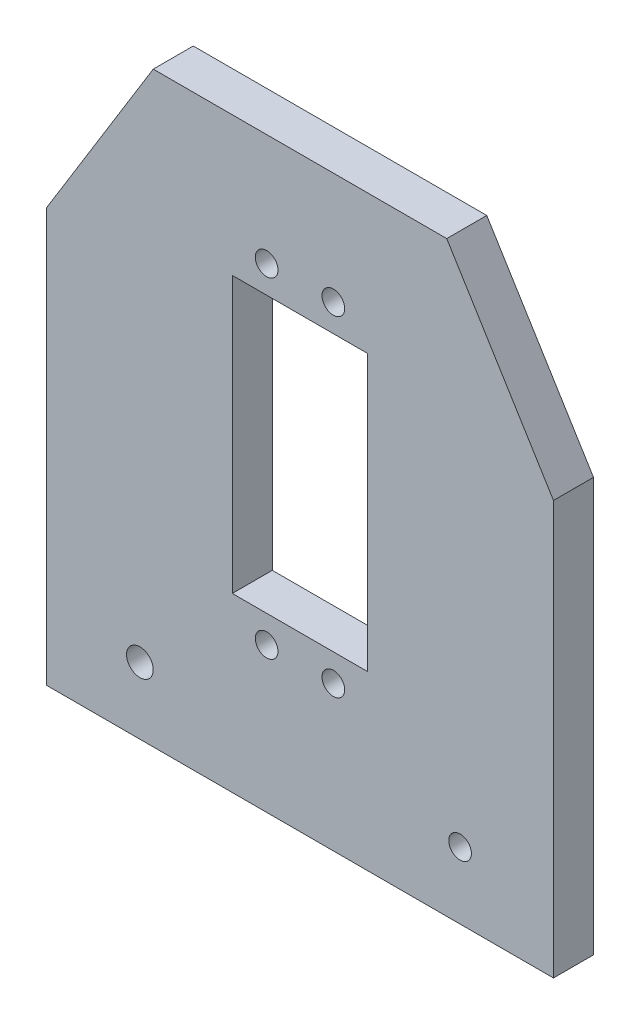
ISO-10303-21;
HEADER;
FILE_DESCRIPTION(('STEP AP214'),'2;1');
FILE_NAME('part.step','',(''),(''),'','','');
FILE_SCHEMA(('AUTOMOTIVE_DESIGN { 1 0 10303 214 1 1 1 1 }'));
ENDSEC;
DATA;
#1=APPLICATION_CONTEXT('core data for automotive mechanical design processes');
#2=APPLICATION_PROTOCOL_DEFINITION('international standard','automotive_design',2000,#1);
#3=PRODUCT_CONTEXT('',#1,'mechanical');
#4=PRODUCT('Part','Part','',(#3));
#5=PRODUCT_RELATED_PRODUCT_CATEGORY('part','',(#4));
#6=PRODUCT_DEFINITION_FORMATION('','',#4);
#7=PRODUCT_DEFINITION_CONTEXT('part definition',#1,'design');
#8=PRODUCT_DEFINITION('design','',#6,#7);
#9=PRODUCT_DEFINITION_SHAPE('','',#8);
#10=(LENGTH_UNIT() NAMED_UNIT(*) SI_UNIT(.MILLI.,.METRE.));
#11=(NAMED_UNIT(*) PLANE_ANGLE_UNIT() SI_UNIT($,.RADIAN.));
#12=(NAMED_UNIT(*) SI_UNIT($,.STERADIAN.) SOLID_ANGLE_UNIT());
#13=UNCERTAINTY_MEASURE_WITH_UNIT(LENGTH_MEASURE(1.E-05),#10,'distance_accuracy_value','');
#14=(GEOMETRIC_REPRESENTATION_CONTEXT(3) GLOBAL_UNCERTAINTY_ASSIGNED_CONTEXT((#13)) GLOBAL_UNIT_ASSIGNED_CONTEXT((#10,
#11,#12)) REPRESENTATION_CONTEXT('',''));
#15=CARTESIAN_POINT('',(0.,0.,0.));
#16=DIRECTION('',(0.,0.,1.));
#17=DIRECTION('',(1.,0.,0.));
#18=AXIS2_PLACEMENT_3D('',#15,#16,#17);
#19=CARTESIAN_POINT('',(0.,0.,6.));
#20=DIRECTION('',(0.,0.,1.));
#21=DIRECTION('',(1.,0.,0.));
#22=AXIS2_PLACEMENT_3D('',#19,#20,#21);
#23=PLANE('',#22);
#24=CARTESIAN_POINT('',(-24.,10.,6.));
#25=DIRECTION('',(0.,0.,1.));
#26=DIRECTION('',(1.,0.,0.));
#27=AXIS2_PLACEMENT_3D('',#24,#25,#26);
#28=CIRCLE('',#27,2.);
#29=CARTESIAN_POINT('',(-22.,10.,6.));
#30=VERTEX_POINT('',#29);
#31=EDGE_CURVE('E289',#30,#30,#28,.T.);
#32=ORIENTED_EDGE('',*,*,#31,.F.);
#33=EDGE_LOOP('',(#32));
#34=FACE_BOUND('',#33,.T.);
#35=CARTESIAN_POINT('',(5.,21.75,6.));
#36=DIRECTION('',(0.,0.,1.));
#37=DIRECTION('',(1.,0.,0.));
#38=AXIS2_PLACEMENT_3D('',#35,#36,#37);
#39=CIRCLE('',#38,1.7);
#40=CARTESIAN_POINT('',(6.7,21.75,6.));
#41=VERTEX_POINT('',#40);
#42=EDGE_CURVE('E301',#41,#41,#39,.T.);
#43=ORIENTED_EDGE('',*,*,#42,.F.);
#44=EDGE_LOOP('',(#43));
#45=FACE_BOUND('',#44,.T.);
#46=CARTESIAN_POINT('',(-5.,21.75,6.));
#47=DIRECTION('',(0.,0.,1.));
#48=DIRECTION('',(1.,0.,0.));
#49=AXIS2_PLACEMENT_3D('',#46,#47,#48);
#50=CIRCLE('',#49,1.7);
#51=CARTESIAN_POINT('',(-3.3,21.75,6.));
#52=VERTEX_POINT('',#51);
#53=EDGE_CURVE('E147',#52,#52,#50,.T.);
#54=ORIENTED_EDGE('',*,*,#53,.F.);
#55=EDGE_LOOP('',(#54));
#56=FACE_BOUND('',#55,.T.);
#57=DIRECTION('',(0.,-1.,0.));
#58=VECTOR('',#57,1.);
#59=CARTESIAN_POINT('',(-38.,62.,6.));
#60=LINE('',#59,#58);
#61=CARTESIAN_POINT('',(-38.,62.,6.));
#62=VERTEX_POINT('',#61);
#63=CARTESIAN_POINT('',(-38.,0.,6.));
#64=VERTEX_POINT('',#63);
#65=EDGE_CURVE('E157',#62,#64,#60,.T.);
#66=ORIENTED_EDGE('',*,*,#65,.T.);
#67=DIRECTION('',(1.,0.,0.));
#68=VECTOR('',#67,1.);
#69=CARTESIAN_POINT('',(-38.,0.,6.));
#70=LINE('',#69,#68);
#71=CARTESIAN_POINT('',(38.,0.,6.));
#72=VERTEX_POINT('',#71);
#73=EDGE_CURVE('E160',#64,#72,#70,.T.);
#74=ORIENTED_EDGE('',*,*,#73,.T.);
#75=DIRECTION('',(0.,1.,0.));
#76=VECTOR('',#75,1.);
#77=CARTESIAN_POINT('',(38.,0.,6.));
#78=LINE('',#77,#76);
#79=CARTESIAN_POINT('',(38.,62.,6.));
#80=VERTEX_POINT('',#79);
#81=EDGE_CURVE('E163',#72,#80,#78,.T.);
#82=ORIENTED_EDGE('',*,*,#81,.T.);
#83=DIRECTION('',(-0.524097425664335,0.851658316704544,0.));
#84=VECTOR('',#83,1.);
#85=CARTESIAN_POINT('',(38.,62.,6.));
#86=LINE('',#85,#84);
#87=CARTESIAN_POINT('',(22.,88.,6.));
#88=VERTEX_POINT('',#87);
#89=EDGE_CURVE('E165',#80,#88,#86,.T.);
#90=ORIENTED_EDGE('',*,*,#89,.T.);
#91=DIRECTION('',(-1.,0.,0.));
#92=VECTOR('',#91,1.);
#93=CARTESIAN_POINT('',(22.,88.,6.));
#94=LINE('',#93,#92);
#95=CARTESIAN_POINT('',(-22.,88.,6.));
#96=VERTEX_POINT('',#95);
#97=EDGE_CURVE('E167',#88,#96,#94,.T.);
#98=ORIENTED_EDGE('',*,*,#97,.T.);
#99=DIRECTION('',(-0.524097425664335,-0.851658316704544,0.));
#100=VECTOR('',#99,1.);
#101=CARTESIAN_POINT('',(-22.,88.,6.));
#102=LINE('',#101,#100);
#103=EDGE_CURVE('E169',#96,#62,#102,.T.);
#104=ORIENTED_EDGE('',*,*,#103,.T.);
#105=EDGE_LOOP('',(#66,#74,#82,#90,#98,#104));
#106=FACE_BOUND('',#105,.T.);
#107=DIRECTION('',(1.,0.,0.));
#108=VECTOR('',#107,1.);
#109=CARTESIAN_POINT('',(-10.15,25.85,6.));
#110=LINE('',#109,#108);
#111=CARTESIAN_POINT('',(-10.15,25.85,6.));
#112=VERTEX_POINT('',#111);
#113=CARTESIAN_POINT('',(10.15,25.85,6.));
#114=VERTEX_POINT('',#113);
#115=EDGE_CURVE('E126',#112,#114,#110,.T.);
#116=ORIENTED_EDGE('',*,*,#115,.F.);
#117=DIRECTION('',(0.,-1.,0.));
#118=VECTOR('',#117,1.);
#119=CARTESIAN_POINT('',(-10.15,25.85,6.));
#120=LINE('',#119,#118);
#121=CARTESIAN_POINT('',(-10.15,67.15,6.));
#122=VERTEX_POINT('',#121);
#123=EDGE_CURVE('E118',#122,#112,#120,.T.);
#124=ORIENTED_EDGE('',*,*,#123,.F.);
#125=DIRECTION('',(-1.,0.,0.));
#126=VECTOR('',#125,1.);
#127=CARTESIAN_POINT('',(-10.15,67.15,6.));
#128=LINE('',#127,#126);
#129=CARTESIAN_POINT('',(10.15,67.15,6.));
#130=VERTEX_POINT('',#129);
#131=EDGE_CURVE('E141',#130,#122,#128,.T.);
#132=ORIENTED_EDGE('',*,*,#131,.F.);
#133=DIRECTION('',(0.,1.,0.));
#134=VECTOR('',#133,1.);
#135=CARTESIAN_POINT('',(10.15,25.85,6.));
#136=LINE('',#135,#134);
#137=EDGE_CURVE('E139',#114,#130,#136,.T.);
#138=ORIENTED_EDGE('',*,*,#137,.F.);
#139=EDGE_LOOP('',(#116,#124,#132,#138));
#140=FACE_BOUND('',#139,.T.);
#141=CARTESIAN_POINT('',(-5.,71.25,6.));
#142=DIRECTION('',(0.,0.,1.));
#143=DIRECTION('',(1.,0.,0.));
#144=AXIS2_PLACEMENT_3D('',#141,#142,#143);
#145=CIRCLE('',#144,1.7);
#146=CARTESIAN_POINT('',(-3.3,71.25,6.));
#147=VERTEX_POINT('',#146);
#148=EDGE_CURVE('E307',#147,#147,#145,.T.);
#149=ORIENTED_EDGE('',*,*,#148,.F.);
#150=EDGE_LOOP('',(#149));
#151=FACE_BOUND('',#150,.T.);
#152=CARTESIAN_POINT('',(5.,71.25,6.));
#153=DIRECTION('',(0.,0.,1.));
#154=DIRECTION('',(1.,0.,0.));
#155=AXIS2_PLACEMENT_3D('',#152,#153,#154);
#156=CIRCLE('',#155,1.7);
#157=CARTESIAN_POINT('',(6.7,71.25,6.));
#158=VERTEX_POINT('',#157);
#159=EDGE_CURVE('E295',#158,#158,#156,.T.);
#160=ORIENTED_EDGE('',*,*,#159,.F.);
#161=EDGE_LOOP('',(#160));
#162=FACE_BOUND('',#161,.T.);
#163=CARTESIAN_POINT('',(24.,10.,6.));
#164=DIRECTION('',(0.,0.,1.));
#165=DIRECTION('',(1.,0.,0.));
#166=AXIS2_PLACEMENT_3D('',#163,#164,#165);
#167=CIRCLE('',#166,1.7);
#168=CARTESIAN_POINT('',(25.7,10.,6.));
#169=VERTEX_POINT('',#168);
#170=EDGE_CURVE('E280',#169,#169,#167,.T.);
#171=ORIENTED_EDGE('',*,*,#170,.F.);
#172=EDGE_LOOP('',(#171));
#173=FACE_BOUND('',#172,.T.);
#174=ADVANCED_FACE('F41',(#34,#45,#56,#106,#140,#151,#162,#173),#23,.T.);
#175=CARTESIAN_POINT('',(0.,0.,0.));
#176=DIRECTION('',(0.,0.,1.));
#177=DIRECTION('',(1.,0.,0.));
#178=AXIS2_PLACEMENT_3D('',#175,#176,#177);
#179=PLANE('',#178);
#180=DIRECTION('',(0.,-1.,0.));
#181=VECTOR('',#180,1.);
#182=CARTESIAN_POINT('',(-38.,62.,0.));
#183=LINE('',#182,#181);
#184=CARTESIAN_POINT('',(-38.,62.,0.));
#185=VERTEX_POINT('',#184);
#186=CARTESIAN_POINT('',(-38.,0.,0.));
#187=VERTEX_POINT('',#186);
#188=EDGE_CURVE('E134',#185,#187,#183,.T.);
#189=ORIENTED_EDGE('',*,*,#188,.F.);
#190=DIRECTION('',(-0.524097425664335,-0.851658316704544,0.));
#191=VECTOR('',#190,1.);
#192=CARTESIAN_POINT('',(-22.,88.,0.));
#193=LINE('',#192,#191);
#194=CARTESIAN_POINT('',(-22.,88.,0.));
#195=VERTEX_POINT('',#194);
#196=EDGE_CURVE('E161',#195,#185,#193,.T.);
#197=ORIENTED_EDGE('',*,*,#196,.F.);
#198=DIRECTION('',(-1.,0.,0.));
#199=VECTOR('',#198,1.);
#200=CARTESIAN_POINT('',(22.,88.,0.));
#201=LINE('',#200,#199);
#202=CARTESIAN_POINT('',(22.,88.,0.));
#203=VERTEX_POINT('',#202);
#204=EDGE_CURVE('E180',#203,#195,#201,.T.);
#205=ORIENTED_EDGE('',*,*,#204,.F.);
#206=DIRECTION('',(-0.524097425664335,0.851658316704544,0.));
#207=VECTOR('',#206,1.);
#208=CARTESIAN_POINT('',(38.,62.,0.));
#209=LINE('',#208,#207);
#210=CARTESIAN_POINT('',(38.,62.,0.));
#211=VERTEX_POINT('',#210);
#212=EDGE_CURVE('E178',#211,#203,#209,.T.);
#213=ORIENTED_EDGE('',*,*,#212,.F.);
#214=DIRECTION('',(0.,1.,0.));
#215=VECTOR('',#214,1.);
#216=CARTESIAN_POINT('',(38.,0.,0.));
#217=LINE('',#216,#215);
#218=CARTESIAN_POINT('',(38.,0.,0.));
#219=VERTEX_POINT('',#218);
#220=EDGE_CURVE('E176',#219,#211,#217,.T.);
#221=ORIENTED_EDGE('',*,*,#220,.F.);
#222=DIRECTION('',(1.,0.,0.));
#223=VECTOR('',#222,1.);
#224=CARTESIAN_POINT('',(-38.,0.,0.));
#225=LINE('',#224,#223);
#226=EDGE_CURVE('E174',#187,#219,#225,.T.);
#227=ORIENTED_EDGE('',*,*,#226,.F.);
#228=EDGE_LOOP('',(#189,#197,#205,#213,#221,#227));
#229=FACE_BOUND('',#228,.T.);
#230=DIRECTION('',(0.,-1.,0.));
#231=VECTOR('',#230,1.);
#232=CARTESIAN_POINT('',(-10.15,25.85,0.));
#233=LINE('',#232,#231);
#234=CARTESIAN_POINT('',(-10.15,67.15,0.));
#235=VERTEX_POINT('',#234);
#236=CARTESIAN_POINT('',(-10.15,25.85,0.));
#237=VERTEX_POINT('',#236);
#238=EDGE_CURVE('E64',#235,#237,#233,.T.);
#239=ORIENTED_EDGE('',*,*,#238,.T.);
#240=DIRECTION('',(1.,0.,0.));
#241=VECTOR('',#240,1.);
#242=CARTESIAN_POINT('',(-10.15,25.85,0.));
#243=LINE('',#242,#241);
#244=CARTESIAN_POINT('',(10.15,25.85,0.));
#245=VERTEX_POINT('',#244);
#246=EDGE_CURVE('E133',#237,#245,#243,.T.);
#247=ORIENTED_EDGE('',*,*,#246,.T.);
#248=DIRECTION('',(0.,1.,0.));
#249=VECTOR('',#248,1.);
#250=CARTESIAN_POINT('',(10.15,25.85,0.));
#251=LINE('',#250,#249);
#252=CARTESIAN_POINT('',(10.15,67.15,0.));
#253=VERTEX_POINT('',#252);
#254=EDGE_CURVE('E149',#245,#253,#251,.T.);
#255=ORIENTED_EDGE('',*,*,#254,.T.);
#256=DIRECTION('',(-1.,0.,0.));
#257=VECTOR('',#256,1.);
#258=CARTESIAN_POINT('',(-10.15,67.15,0.));
#259=LINE('',#258,#257);
#260=EDGE_CURVE('E127',#253,#235,#259,.T.);
#261=ORIENTED_EDGE('',*,*,#260,.T.);
#262=EDGE_LOOP('',(#239,#247,#255,#261));
#263=FACE_BOUND('',#262,.T.);
#264=CARTESIAN_POINT('',(-5.,21.75,0.));
#265=DIRECTION('',(0.,0.,1.));
#266=DIRECTION('',(1.,0.,0.));
#267=AXIS2_PLACEMENT_3D('',#264,#265,#266);
#268=CIRCLE('',#267,1.7);
#269=CARTESIAN_POINT('',(-3.3,21.75,0.));
#270=VERTEX_POINT('',#269);
#271=EDGE_CURVE('E310',#270,#270,#268,.T.);
#272=ORIENTED_EDGE('',*,*,#271,.T.);
#273=EDGE_LOOP('',(#272));
#274=FACE_BOUND('',#273,.T.);
#275=CARTESIAN_POINT('',(-5.,71.25,0.));
#276=DIRECTION('',(0.,0.,1.));
#277=DIRECTION('',(1.,0.,0.));
#278=AXIS2_PLACEMENT_3D('',#275,#276,#277);
#279=CIRCLE('',#278,1.7);
#280=CARTESIAN_POINT('',(-3.3,71.25,0.));
#281=VERTEX_POINT('',#280);
#282=EDGE_CURVE('E304',#281,#281,#279,.T.);
#283=ORIENTED_EDGE('',*,*,#282,.T.);
#284=EDGE_LOOP('',(#283));
#285=FACE_BOUND('',#284,.T.);
#286=CARTESIAN_POINT('',(5.,21.75,0.));
#287=DIRECTION('',(0.,0.,1.));
#288=DIRECTION('',(1.,0.,0.));
#289=AXIS2_PLACEMENT_3D('',#286,#287,#288);
#290=CIRCLE('',#289,1.7);
#291=CARTESIAN_POINT('',(6.7,21.75,0.));
#292=VERTEX_POINT('',#291);
#293=EDGE_CURVE('E298',#292,#292,#290,.T.);
#294=ORIENTED_EDGE('',*,*,#293,.T.);
#295=EDGE_LOOP('',(#294));
#296=FACE_BOUND('',#295,.T.);
#297=CARTESIAN_POINT('',(5.,71.25,0.));
#298=DIRECTION('',(0.,0.,1.));
#299=DIRECTION('',(1.,0.,0.));
#300=AXIS2_PLACEMENT_3D('',#297,#298,#299);
#301=CIRCLE('',#300,1.7);
#302=CARTESIAN_POINT('',(6.7,71.25,0.));
#303=VERTEX_POINT('',#302);
#304=EDGE_CURVE('E292',#303,#303,#301,.T.);
#305=ORIENTED_EDGE('',*,*,#304,.T.);
#306=EDGE_LOOP('',(#305));
#307=FACE_BOUND('',#306,.T.);
#308=CARTESIAN_POINT('',(-24.,10.,0.));
#309=DIRECTION('',(0.,0.,1.));
#310=DIRECTION('',(1.,0.,0.));
#311=AXIS2_PLACEMENT_3D('',#308,#309,#310);
#312=CIRCLE('',#311,2.);
#313=CARTESIAN_POINT('',(-22.,10.,0.));
#314=VERTEX_POINT('',#313);
#315=EDGE_CURVE('E286',#314,#314,#312,.T.);
#316=ORIENTED_EDGE('',*,*,#315,.T.);
#317=EDGE_LOOP('',(#316));
#318=FACE_BOUND('',#317,.T.);
#319=CARTESIAN_POINT('',(24.,10.,0.));
#320=DIRECTION('',(0.,0.,1.));
#321=DIRECTION('',(1.,0.,0.));
#322=AXIS2_PLACEMENT_3D('',#319,#320,#321);
#323=CIRCLE('',#322,1.7);
#324=CARTESIAN_POINT('',(25.7,10.,0.));
#325=VERTEX_POINT('',#324);
#326=EDGE_CURVE('E283',#325,#325,#323,.T.);
#327=ORIENTED_EDGE('',*,*,#326,.T.);
#328=EDGE_LOOP('',(#327));
#329=FACE_BOUND('',#328,.T.);
#330=ADVANCED_FACE('F204',(#229,#263,#274,#285,#296,#307,#318,#329),#179,.F.);
#331=CARTESIAN_POINT('',(-38.,62.,6.));
#332=DIRECTION('',(1.,0.,0.));
#333=DIRECTION('',(0.,0.,-1.));
#334=AXIS2_PLACEMENT_3D('',#331,#332,#333);
#335=PLANE('',#334);
#336=ORIENTED_EDGE('',*,*,#188,.T.);
#337=DIRECTION('',(0.,0.,-1.));
#338=VECTOR('',#337,1.);
#339=CARTESIAN_POINT('',(-38.,0.,6.));
#340=LINE('',#339,#338);
#341=EDGE_CURVE('E11',#64,#187,#340,.T.);
#342=ORIENTED_EDGE('',*,*,#341,.F.);
#343=ORIENTED_EDGE('',*,*,#65,.F.);
#344=DIRECTION('',(0.,0.,-1.));
#345=VECTOR('',#344,1.);
#346=CARTESIAN_POINT('',(-38.,62.,6.));
#347=LINE('',#346,#345);
#348=EDGE_CURVE('E171',#62,#185,#347,.T.);
#349=ORIENTED_EDGE('',*,*,#348,.T.);
#350=EDGE_LOOP('',(#336,#342,#343,#349));
#351=FACE_BOUND('',#350,.T.);
#352=ADVANCED_FACE('F43',(#351),#335,.F.);
#353=CARTESIAN_POINT('',(-38.,0.,6.));
#354=DIRECTION('',(0.,1.,0.));
#355=DIRECTION('',(0.,0.,1.));
#356=AXIS2_PLACEMENT_3D('',#353,#354,#355);
#357=PLANE('',#356);
#358=ORIENTED_EDGE('',*,*,#226,.T.);
#359=DIRECTION('',(0.,0.,-1.));
#360=VECTOR('',#359,1.);
#361=CARTESIAN_POINT('',(38.,0.,6.));
#362=LINE('',#361,#360);
#363=EDGE_CURVE('E49',#72,#219,#362,.T.);
#364=ORIENTED_EDGE('',*,*,#363,.F.);
#365=ORIENTED_EDGE('',*,*,#73,.F.);
#366=ORIENTED_EDGE('',*,*,#341,.T.);
#367=EDGE_LOOP('',(#358,#364,#365,#366));
#368=FACE_BOUND('',#367,.T.);
#369=ADVANCED_FACE('F221',(#368),#357,.F.);
#370=CARTESIAN_POINT('',(38.,0.,6.));
#371=DIRECTION('',(-1.,0.,0.));
#372=DIRECTION('',(0.,0.,1.));
#373=AXIS2_PLACEMENT_3D('',#370,#371,#372);
#374=PLANE('',#373);
#375=ORIENTED_EDGE('',*,*,#220,.T.);
#376=DIRECTION('',(0.,0.,-1.));
#377=VECTOR('',#376,1.);
#378=CARTESIAN_POINT('',(38.,62.,6.));
#379=LINE('',#378,#377);
#380=EDGE_CURVE('E191',#80,#211,#379,.T.);
#381=ORIENTED_EDGE('',*,*,#380,.F.);
#382=ORIENTED_EDGE('',*,*,#81,.F.);
#383=ORIENTED_EDGE('',*,*,#363,.T.);
#384=EDGE_LOOP('',(#375,#381,#382,#383));
#385=FACE_BOUND('',#384,.T.);
#386=ADVANCED_FACE('F198',(#385),#374,.F.);
#387=CARTESIAN_POINT('',(38.,62.,6.));
#388=DIRECTION('',(-0.851658316704544,-0.524097425664335,0.));
#389=DIRECTION('',(0.524097425664335,-0.851658316704544,0.));
#390=AXIS2_PLACEMENT_3D('',#387,#388,#389);
#391=PLANE('',#390);
#392=ORIENTED_EDGE('',*,*,#212,.T.);
#393=DIRECTION('',(0.,0.,-1.));
#394=VECTOR('',#393,1.);
#395=CARTESIAN_POINT('',(22.,88.,6.));
#396=LINE('',#395,#394);
#397=EDGE_CURVE('E188',#88,#203,#396,.T.);
#398=ORIENTED_EDGE('',*,*,#397,.F.);
#399=ORIENTED_EDGE('',*,*,#89,.F.);
#400=ORIENTED_EDGE('',*,*,#380,.T.);
#401=EDGE_LOOP('',(#392,#398,#399,#400));
#402=FACE_BOUND('',#401,.T.);
#403=ADVANCED_FACE('F210',(#402),#391,.F.);
#404=CARTESIAN_POINT('',(22.,88.,6.));
#405=DIRECTION('',(0.,-1.,0.));
#406=DIRECTION('',(0.,0.,-1.));
#407=AXIS2_PLACEMENT_3D('',#404,#405,#406);
#408=PLANE('',#407);
#409=ORIENTED_EDGE('',*,*,#204,.T.);
#410=DIRECTION('',(0.,0.,-1.));
#411=VECTOR('',#410,1.);
#412=CARTESIAN_POINT('',(-22.,88.,6.));
#413=LINE('',#412,#411);
#414=EDGE_CURVE('E185',#96,#195,#413,.T.);
#415=ORIENTED_EDGE('',*,*,#414,.F.);
#416=ORIENTED_EDGE('',*,*,#97,.F.);
#417=ORIENTED_EDGE('',*,*,#397,.T.);
#418=EDGE_LOOP('',(#409,#415,#416,#417));
#419=FACE_BOUND('',#418,.T.);
#420=ADVANCED_FACE('F214',(#419),#408,.F.);
#421=CARTESIAN_POINT('',(-22.,88.,6.));
#422=DIRECTION('',(0.851658316704544,-0.524097425664335,0.));
#423=DIRECTION('',(0.524097425664335,0.851658316704544,0.));
#424=AXIS2_PLACEMENT_3D('',#421,#422,#423);
#425=PLANE('',#424);
#426=ORIENTED_EDGE('',*,*,#196,.T.);
#427=ORIENTED_EDGE('',*,*,#348,.F.);
#428=ORIENTED_EDGE('',*,*,#103,.F.);
#429=ORIENTED_EDGE('',*,*,#414,.T.);
#430=EDGE_LOOP('',(#426,#427,#428,#429));
#431=FACE_BOUND('',#430,.T.);
#432=ADVANCED_FACE('F224',(#431),#425,.F.);
#433=CARTESIAN_POINT('',(-10.15,25.85,6.));
#434=DIRECTION('',(1.,0.,0.));
#435=DIRECTION('',(0.,0.,-1.));
#436=AXIS2_PLACEMENT_3D('',#433,#434,#435);
#437=PLANE('',#436);
#438=ORIENTED_EDGE('',*,*,#238,.F.);
#439=DIRECTION('',(0.,0.,-1.));
#440=VECTOR('',#439,1.);
#441=CARTESIAN_POINT('',(-10.15,67.15,6.));
#442=LINE('',#441,#440);
#443=EDGE_CURVE('E122',#122,#235,#442,.T.);
#444=ORIENTED_EDGE('',*,*,#443,.F.);
#445=ORIENTED_EDGE('',*,*,#123,.T.);
#446=DIRECTION('',(0.,0.,-1.));
#447=VECTOR('',#446,1.);
#448=CARTESIAN_POINT('',(-10.15,25.85,6.));
#449=LINE('',#448,#447);
#450=EDGE_CURVE('E121',#112,#237,#449,.T.);
#451=ORIENTED_EDGE('',*,*,#450,.T.);
#452=EDGE_LOOP('',(#438,#444,#445,#451));
#453=FACE_BOUND('',#452,.T.);
#454=ADVANCED_FACE('F120',(#453),#437,.T.);
#455=CARTESIAN_POINT('',(-10.15,25.85,6.));
#456=DIRECTION('',(0.,1.,0.));
#457=DIRECTION('',(0.,0.,1.));
#458=AXIS2_PLACEMENT_3D('',#455,#456,#457);
#459=PLANE('',#458);
#460=ORIENTED_EDGE('',*,*,#246,.F.);
#461=ORIENTED_EDGE('',*,*,#450,.F.);
#462=ORIENTED_EDGE('',*,*,#115,.T.);
#463=DIRECTION('',(0.,0.,-1.));
#464=VECTOR('',#463,1.);
#465=CARTESIAN_POINT('',(10.15,25.85,6.));
#466=LINE('',#465,#464);
#467=EDGE_CURVE('E135',#114,#245,#466,.T.);
#468=ORIENTED_EDGE('',*,*,#467,.T.);
#469=EDGE_LOOP('',(#460,#461,#462,#468));
#470=FACE_BOUND('',#469,.T.);
#471=ADVANCED_FACE('F130',(#470),#459,.T.);
#472=CARTESIAN_POINT('',(10.15,25.85,6.));
#473=DIRECTION('',(-1.,0.,0.));
#474=DIRECTION('',(0.,0.,1.));
#475=AXIS2_PLACEMENT_3D('',#472,#473,#474);
#476=PLANE('',#475);
#477=ORIENTED_EDGE('',*,*,#254,.F.);
#478=ORIENTED_EDGE('',*,*,#467,.F.);
#479=ORIENTED_EDGE('',*,*,#137,.T.);
#480=DIRECTION('',(0.,0.,-1.));
#481=VECTOR('',#480,1.);
#482=CARTESIAN_POINT('',(10.15,67.15,6.));
#483=LINE('',#482,#481);
#484=EDGE_CURVE('E56',#130,#253,#483,.T.);
#485=ORIENTED_EDGE('',*,*,#484,.T.);
#486=EDGE_LOOP('',(#477,#478,#479,#485));
#487=FACE_BOUND('',#486,.T.);
#488=ADVANCED_FACE('F245',(#487),#476,.T.);
#489=CARTESIAN_POINT('',(-10.15,67.15,6.));
#490=DIRECTION('',(0.,-1.,0.));
#491=DIRECTION('',(0.,0.,-1.));
#492=AXIS2_PLACEMENT_3D('',#489,#490,#491);
#493=PLANE('',#492);
#494=ORIENTED_EDGE('',*,*,#260,.F.);
#495=ORIENTED_EDGE('',*,*,#484,.F.);
#496=ORIENTED_EDGE('',*,*,#131,.T.);
#497=ORIENTED_EDGE('',*,*,#443,.T.);
#498=EDGE_LOOP('',(#494,#495,#496,#497));
#499=FACE_BOUND('',#498,.T.);
#500=ADVANCED_FACE('F248',(#499),#493,.T.);
#501=CARTESIAN_POINT('',(-5.,21.75,6.));
#502=DIRECTION('',(0.,0.,-1.));
#503=DIRECTION('',(-1.,0.,0.));
#504=AXIS2_PLACEMENT_3D('',#501,#502,#503);
#505=CYLINDRICAL_SURFACE('',#504,1.7);
#506=ORIENTED_EDGE('',*,*,#53,.T.);
#507=EDGE_LOOP('',(#506));
#508=FACE_BOUND('',#507,.T.);
#509=ORIENTED_EDGE('',*,*,#271,.F.);
#510=EDGE_LOOP('',(#509));
#511=FACE_BOUND('',#510,.T.);
#512=ADVANCED_FACE('F252',(#508,#511),#505,.F.);
#513=CARTESIAN_POINT('',(-5.,71.25,6.));
#514=DIRECTION('',(0.,0.,-1.));
#515=DIRECTION('',(-1.,0.,0.));
#516=AXIS2_PLACEMENT_3D('',#513,#514,#515);
#517=CYLINDRICAL_SURFACE('',#516,1.7);
#518=ORIENTED_EDGE('',*,*,#148,.T.);
#519=EDGE_LOOP('',(#518));
#520=FACE_BOUND('',#519,.T.);
#521=ORIENTED_EDGE('',*,*,#282,.F.);
#522=EDGE_LOOP('',(#521));
#523=FACE_BOUND('',#522,.T.);
#524=ADVANCED_FACE('F255',(#520,#523),#517,.F.);
#525=CARTESIAN_POINT('',(5.,21.75,6.));
#526=DIRECTION('',(0.,0.,-1.));
#527=DIRECTION('',(-1.,0.,0.));
#528=AXIS2_PLACEMENT_3D('',#525,#526,#527);
#529=CYLINDRICAL_SURFACE('',#528,1.7);
#530=ORIENTED_EDGE('',*,*,#42,.T.);
#531=EDGE_LOOP('',(#530));
#532=FACE_BOUND('',#531,.T.);
#533=ORIENTED_EDGE('',*,*,#293,.F.);
#534=EDGE_LOOP('',(#533));
#535=FACE_BOUND('',#534,.T.);
#536=ADVANCED_FACE('F259',(#532,#535),#529,.F.);
#537=CARTESIAN_POINT('',(5.,71.25,6.));
#538=DIRECTION('',(0.,0.,-1.));
#539=DIRECTION('',(-1.,0.,0.));
#540=AXIS2_PLACEMENT_3D('',#537,#538,#539);
#541=CYLINDRICAL_SURFACE('',#540,1.7);
#542=ORIENTED_EDGE('',*,*,#159,.T.);
#543=EDGE_LOOP('',(#542));
#544=FACE_BOUND('',#543,.T.);
#545=ORIENTED_EDGE('',*,*,#304,.F.);
#546=EDGE_LOOP('',(#545));
#547=FACE_BOUND('',#546,.T.);
#548=ADVANCED_FACE('F263',(#544,#547),#541,.F.);
#549=CARTESIAN_POINT('',(-24.,10.,6.));
#550=DIRECTION('',(0.,0.,-1.));
#551=DIRECTION('',(-1.,0.,0.));
#552=AXIS2_PLACEMENT_3D('',#549,#550,#551);
#553=CYLINDRICAL_SURFACE('',#552,2.);
#554=ORIENTED_EDGE('',*,*,#31,.T.);
#555=EDGE_LOOP('',(#554));
#556=FACE_BOUND('',#555,.T.);
#557=ORIENTED_EDGE('',*,*,#315,.F.);
#558=EDGE_LOOP('',(#557));
#559=FACE_BOUND('',#558,.T.);
#560=ADVANCED_FACE('F267',(#556,#559),#553,.F.);
#561=CARTESIAN_POINT('',(24.,10.,6.));
#562=DIRECTION('',(0.,0.,-1.));
#563=DIRECTION('',(-1.,0.,0.));
#564=AXIS2_PLACEMENT_3D('',#561,#562,#563);
#565=CYLINDRICAL_SURFACE('',#564,1.7);
#566=ORIENTED_EDGE('',*,*,#170,.T.);
#567=EDGE_LOOP('',(#566));
#568=FACE_BOUND('',#567,.T.);
#569=ORIENTED_EDGE('',*,*,#326,.F.);
#570=EDGE_LOOP('',(#569));
#571=FACE_BOUND('',#570,.T.);
#572=ADVANCED_FACE('F271',(#568,#571),#565,.F.);
#573=CLOSED_SHELL('',(#174,#330,#352,#369,#386,#403,#420,#432,#454,#471,#488,#500,#512,#524,
#536,#548,#560,#572));
#574=MANIFOLD_SOLID_BREP('B2',#573);
#575=ADVANCED_BREP_SHAPE_REPRESENTATION('',(#18,#574),#14);
#576=SHAPE_DEFINITION_REPRESENTATION(#9,#575);
ENDSEC;
END-ISO-10303-21;
